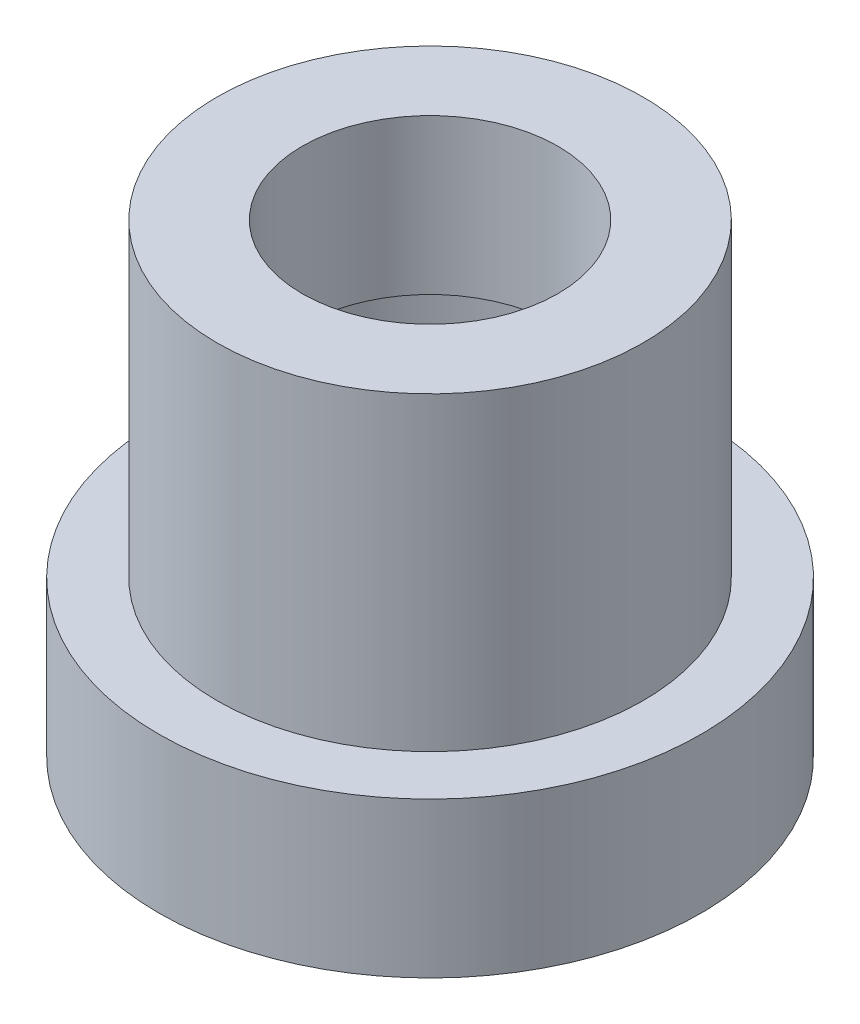
ISO-10303-21;
HEADER;
FILE_DESCRIPTION(('STEP AP214'),'2;1');
FILE_NAME('part.step','',(''),(''),'','','');
FILE_SCHEMA(('AUTOMOTIVE_DESIGN { 1 0 10303 214 1 1 1 1 }'));
ENDSEC;
DATA;
#1=APPLICATION_CONTEXT('core data for automotive mechanical design processes');
#2=APPLICATION_PROTOCOL_DEFINITION('international standard','automotive_design',2000,#1);
#3=PRODUCT_CONTEXT('',#1,'mechanical');
#4=PRODUCT('Part','Part','',(#3));
#5=PRODUCT_RELATED_PRODUCT_CATEGORY('part','',(#4));
#6=PRODUCT_DEFINITION_FORMATION('','',#4);
#7=PRODUCT_DEFINITION_CONTEXT('part definition',#1,'design');
#8=PRODUCT_DEFINITION('design','',#6,#7);
#9=PRODUCT_DEFINITION_SHAPE('','',#8);
#10=(LENGTH_UNIT() NAMED_UNIT(*) SI_UNIT(.MILLI.,.METRE.));
#11=(NAMED_UNIT(*) PLANE_ANGLE_UNIT() SI_UNIT($,.RADIAN.));
#12=(NAMED_UNIT(*) SI_UNIT($,.STERADIAN.) SOLID_ANGLE_UNIT());
#13=UNCERTAINTY_MEASURE_WITH_UNIT(LENGTH_MEASURE(1.E-05),#10,'distance_accuracy_value','');
#14=(GEOMETRIC_REPRESENTATION_CONTEXT(3) GLOBAL_UNCERTAINTY_ASSIGNED_CONTEXT((#13)) GLOBAL_UNIT_ASSIGNED_CONTEXT((#10,
#11,#12)) REPRESENTATION_CONTEXT('',''));
#15=CARTESIAN_POINT('',(0.,0.,0.));
#16=DIRECTION('',(0.,0.,1.));
#17=DIRECTION('',(1.,0.,0.));
#18=AXIS2_PLACEMENT_3D('',#15,#16,#17);
#19=CARTESIAN_POINT('',(0.,6.,0.));
#20=DIRECTION('',(0.,-1.,0.));
#21=DIRECTION('',(0.,0.,-1.));
#22=AXIS2_PLACEMENT_3D('',#19,#20,#21);
#23=CYLINDRICAL_SURFACE('',#22,1.65);
#24=CARTESIAN_POINT('',(0.,6.,0.));
#25=DIRECTION('',(0.,1.,0.));
#26=DIRECTION('',(0.,0.,1.));
#27=AXIS2_PLACEMENT_3D('',#24,#25,#26);
#28=CIRCLE('',#27,1.65);
#29=CARTESIAN_POINT('',(0.,6.,1.65));
#30=VERTEX_POINT('',#29);
#31=EDGE_CURVE('E78',#30,#30,#28,.T.);
#32=ORIENTED_EDGE('',*,*,#31,.T.);
#33=EDGE_LOOP('',(#32));
#34=FACE_BOUND('',#33,.T.);
#35=CARTESIAN_POINT('',(0.,4.,0.));
#36=DIRECTION('',(0.,-1.,0.));
#37=DIRECTION('',(0.,0.,-1.));
#38=AXIS2_PLACEMENT_3D('',#35,#36,#37);
#39=CIRCLE('',#38,1.65);
#40=CARTESIAN_POINT('',(0.,4.,-1.65));
#41=VERTEX_POINT('',#40);
#42=EDGE_CURVE('E41',#41,#41,#39,.T.);
#43=ORIENTED_EDGE('',*,*,#42,.T.);
#44=EDGE_LOOP('',(#43));
#45=FACE_BOUND('',#44,.T.);
#46=ADVANCED_FACE('F40',(#34,#45),#23,.F.);
#47=CARTESIAN_POINT('',(0.,2.,0.));
#48=DIRECTION('',(0.,1.,0.));
#49=DIRECTION('',(0.,0.,1.));
#50=AXIS2_PLACEMENT_3D('',#47,#48,#49);
#51=PLANE('',#50);
#52=CARTESIAN_POINT('',(0.,2.,0.));
#53=DIRECTION('',(0.,1.,0.));
#54=DIRECTION('',(0.,0.,1.));
#55=AXIS2_PLACEMENT_3D('',#52,#53,#54);
#56=CIRCLE('',#55,2.75);
#57=CARTESIAN_POINT('',(0.,2.,2.75));
#58=VERTEX_POINT('',#57);
#59=EDGE_CURVE('E10',#58,#58,#56,.T.);
#60=ORIENTED_EDGE('',*,*,#59,.F.);
#61=EDGE_LOOP('',(#60));
#62=FACE_BOUND('',#61,.T.);
#63=CARTESIAN_POINT('',(0.,2.,0.));
#64=DIRECTION('',(0.,1.,0.));
#65=DIRECTION('',(0.,0.,1.));
#66=AXIS2_PLACEMENT_3D('',#63,#64,#65);
#67=CIRCLE('',#66,3.5);
#68=CARTESIAN_POINT('',(0.,2.,3.5));
#69=VERTEX_POINT('',#68);
#70=EDGE_CURVE('E44',#69,#69,#67,.T.);
#71=ORIENTED_EDGE('',*,*,#70,.T.);
#72=EDGE_LOOP('',(#71));
#73=FACE_BOUND('',#72,.T.);
#74=ADVANCED_FACE('F64',(#62,#73),#51,.T.);
#75=CARTESIAN_POINT('',(0.,0.,0.));
#76=DIRECTION('',(0.,1.,0.));
#77=DIRECTION('',(0.,0.,1.));
#78=AXIS2_PLACEMENT_3D('',#75,#76,#77);
#79=PLANE('',#78);
#80=CARTESIAN_POINT('',(0.,0.,0.));
#81=DIRECTION('',(0.,1.,0.));
#82=DIRECTION('',(0.,0.,1.));
#83=AXIS2_PLACEMENT_3D('',#80,#81,#82);
#84=CIRCLE('',#83,3.5);
#85=CARTESIAN_POINT('',(0.,0.,3.5));
#86=VERTEX_POINT('',#85);
#87=EDGE_CURVE('E49',#86,#86,#84,.T.);
#88=ORIENTED_EDGE('',*,*,#87,.F.);
#89=EDGE_LOOP('',(#88));
#90=FACE_BOUND('',#89,.T.);
#91=CARTESIAN_POINT('',(0.,0.,0.));
#92=DIRECTION('',(0.,1.,0.));
#93=DIRECTION('',(0.,0.,1.));
#94=AXIS2_PLACEMENT_3D('',#91,#92,#93);
#95=CIRCLE('',#94,2.5);
#96=CARTESIAN_POINT('',(0.,0.,2.5));
#97=VERTEX_POINT('',#96);
#98=EDGE_CURVE('E57',#97,#97,#95,.T.);
#99=ORIENTED_EDGE('',*,*,#98,.T.);
#100=EDGE_LOOP('',(#99));
#101=FACE_BOUND('',#100,.T.);
#102=ADVANCED_FACE('F65',(#90,#101),#79,.F.);
#103=CARTESIAN_POINT('',(0.,2.,0.));
#104=DIRECTION('',(0.,-1.,0.));
#105=DIRECTION('',(0.,0.,-1.));
#106=AXIS2_PLACEMENT_3D('',#103,#104,#105);
#107=CYLINDRICAL_SURFACE('',#106,3.5);
#108=ORIENTED_EDGE('',*,*,#70,.F.);
#109=EDGE_LOOP('',(#108));
#110=FACE_BOUND('',#109,.T.);
#111=ORIENTED_EDGE('',*,*,#87,.T.);
#112=EDGE_LOOP('',(#111));
#113=FACE_BOUND('',#112,.T.);
#114=ADVANCED_FACE('F39',(#110,#113),#107,.T.);
#115=CARTESIAN_POINT('',(0.,2.,0.));
#116=DIRECTION('',(0.,-1.,0.));
#117=DIRECTION('',(0.,0.,-1.));
#118=AXIS2_PLACEMENT_3D('',#115,#116,#117);
#119=CYLINDRICAL_SURFACE('',#118,2.5);
#120=ORIENTED_EDGE('',*,*,#98,.F.);
#121=EDGE_LOOP('',(#120));
#122=FACE_BOUND('',#121,.T.);
#123=CARTESIAN_POINT('',(0.,4.,0.));
#124=DIRECTION('',(0.,-1.,0.));
#125=DIRECTION('',(0.,0.,-1.));
#126=AXIS2_PLACEMENT_3D('',#123,#124,#125);
#127=CIRCLE('',#126,2.5);
#128=CARTESIAN_POINT('',(0.,4.,-2.5));
#129=VERTEX_POINT('',#128);
#130=EDGE_CURVE('E73',#129,#129,#127,.T.);
#131=ORIENTED_EDGE('',*,*,#130,.F.);
#132=EDGE_LOOP('',(#131));
#133=FACE_BOUND('',#132,.T.);
#134=ADVANCED_FACE('F70',(#122,#133),#119,.F.);
#135=CARTESIAN_POINT('',(0.,6.,0.));
#136=DIRECTION('',(0.,1.,0.));
#137=DIRECTION('',(0.,0.,1.));
#138=AXIS2_PLACEMENT_3D('',#135,#136,#137);
#139=PLANE('',#138);
#140=CARTESIAN_POINT('',(0.,6.,0.));
#141=DIRECTION('',(0.,1.,0.));
#142=DIRECTION('',(0.,0.,1.));
#143=AXIS2_PLACEMENT_3D('',#140,#141,#142);
#144=CIRCLE('',#143,2.75);
#145=CARTESIAN_POINT('',(0.,6.,2.75));
#146=VERTEX_POINT('',#145);
#147=EDGE_CURVE('E53',#146,#146,#144,.T.);
#148=ORIENTED_EDGE('',*,*,#147,.T.);
#149=EDGE_LOOP('',(#148));
#150=FACE_BOUND('',#149,.T.);
#151=ORIENTED_EDGE('',*,*,#31,.F.);
#152=EDGE_LOOP('',(#151));
#153=FACE_BOUND('',#152,.T.);
#154=ADVANCED_FACE('F72',(#150,#153),#139,.T.);
#155=CARTESIAN_POINT('',(0.,6.,0.));
#156=DIRECTION('',(0.,-1.,0.));
#157=DIRECTION('',(0.,0.,-1.));
#158=AXIS2_PLACEMENT_3D('',#155,#156,#157);
#159=CYLINDRICAL_SURFACE('',#158,2.75);
#160=ORIENTED_EDGE('',*,*,#147,.F.);
#161=EDGE_LOOP('',(#160));
#162=FACE_BOUND('',#161,.T.);
#163=ORIENTED_EDGE('',*,*,#59,.T.);
#164=EDGE_LOOP('',(#163));
#165=FACE_BOUND('',#164,.T.);
#166=ADVANCED_FACE('F86',(#162,#165),#159,.T.);
#167=CARTESIAN_POINT('',(0.,4.,0.));
#168=DIRECTION('',(0.,-1.,0.));
#169=DIRECTION('',(0.,0.,-1.));
#170=AXIS2_PLACEMENT_3D('',#167,#168,#169);
#171=PLANE('',#170);
#172=ORIENTED_EDGE('',*,*,#42,.F.);
#173=EDGE_LOOP('',(#172));
#174=FACE_BOUND('',#173,.T.);
#175=ORIENTED_EDGE('',*,*,#130,.T.);
#176=EDGE_LOOP('',(#175));
#177=FACE_BOUND('',#176,.T.);
#178=ADVANCED_FACE('F89',(#174,#177),#171,.T.);
#179=CLOSED_SHELL('',(#46,#74,#102,#114,#134,#154,#166,#178));
#180=MANIFOLD_SOLID_BREP('B2',#179);
#181=ADVANCED_BREP_SHAPE_REPRESENTATION('',(#18,#180),#14);
#182=SHAPE_DEFINITION_REPRESENTATION(#9,#181);
ENDSEC;
END-ISO-10303-21;
